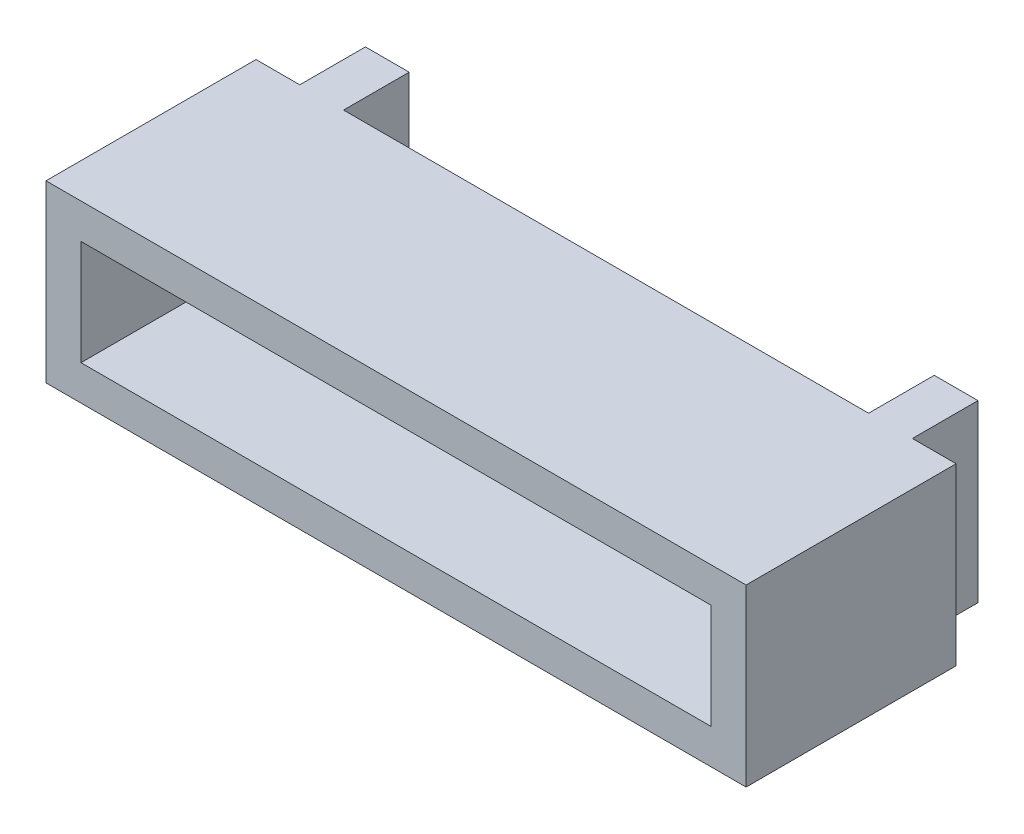
ISO-10303-21;
HEADER;
FILE_DESCRIPTION(('STEP AP214'),'2;1');
FILE_NAME('part.step','',(''),(''),'','','');
FILE_SCHEMA(('AUTOMOTIVE_DESIGN { 1 0 10303 214 1 1 1 1 }'));
ENDSEC;
DATA;
#1=APPLICATION_CONTEXT('core data for automotive mechanical design processes');
#2=APPLICATION_PROTOCOL_DEFINITION('international standard','automotive_design',2000,#1);
#3=PRODUCT_CONTEXT('',#1,'mechanical');
#4=PRODUCT('Part','Part','',(#3));
#5=PRODUCT_RELATED_PRODUCT_CATEGORY('part','',(#4));
#6=PRODUCT_DEFINITION_FORMATION('','',#4);
#7=PRODUCT_DEFINITION_CONTEXT('part definition',#1,'design');
#8=PRODUCT_DEFINITION('design','',#6,#7);
#9=PRODUCT_DEFINITION_SHAPE('','',#8);
#10=(LENGTH_UNIT() NAMED_UNIT(*) SI_UNIT(.MILLI.,.METRE.));
#11=(NAMED_UNIT(*) PLANE_ANGLE_UNIT() SI_UNIT($,.RADIAN.));
#12=(NAMED_UNIT(*) SI_UNIT($,.STERADIAN.) SOLID_ANGLE_UNIT());
#13=UNCERTAINTY_MEASURE_WITH_UNIT(LENGTH_MEASURE(1.E-05),#10,'distance_accuracy_value','');
#14=(GEOMETRIC_REPRESENTATION_CONTEXT(3) GLOBAL_UNCERTAINTY_ASSIGNED_CONTEXT((#13)) GLOBAL_UNIT_ASSIGNED_CONTEXT((#10,
#11,#12)) REPRESENTATION_CONTEXT('',''));
#15=CARTESIAN_POINT('',(0.,0.,0.));
#16=DIRECTION('',(0.,0.,1.));
#17=DIRECTION('',(1.,0.,0.));
#18=AXIS2_PLACEMENT_3D('',#15,#16,#17);
#19=CARTESIAN_POINT('',(-16.,8.,0.));
#20=DIRECTION('',(0.,0.,-1.));
#21=DIRECTION('',(-1.,0.,0.));
#22=AXIS2_PLACEMENT_3D('',#19,#20,#21);
#23=PLANE('',#22);
#24=DIRECTION('',(1.,0.,0.));
#25=VECTOR('',#24,1.);
#26=CARTESIAN_POINT('',(-16.,0.,0.));
#27=LINE('',#26,#25);
#28=CARTESIAN_POINT('',(-16.,0.,0.));
#29=VERTEX_POINT('',#28);
#30=CARTESIAN_POINT('',(16.,0.,0.));
#31=VERTEX_POINT('',#30);
#32=EDGE_CURVE('E192',#29,#31,#27,.T.);
#33=ORIENTED_EDGE('',*,*,#32,.T.);
#34=DIRECTION('',(0.,-1.,0.));
#35=VECTOR('',#34,1.);
#36=CARTESIAN_POINT('',(16.,8.,0.));
#37=LINE('',#36,#35);
#38=CARTESIAN_POINT('',(16.,8.,0.));
#39=VERTEX_POINT('',#38);
#40=EDGE_CURVE('E163',#39,#31,#37,.T.);
#41=ORIENTED_EDGE('',*,*,#40,.F.);
#42=DIRECTION('',(1.,0.,0.));
#43=VECTOR('',#42,1.);
#44=CARTESIAN_POINT('',(-16.,8.,0.));
#45=LINE('',#44,#43);
#46=CARTESIAN_POINT('',(-16.,8.,0.));
#47=VERTEX_POINT('',#46);
#48=EDGE_CURVE('E147',#47,#39,#45,.T.);
#49=ORIENTED_EDGE('',*,*,#48,.F.);
#50=DIRECTION('',(0.,-1.,0.));
#51=VECTOR('',#50,1.);
#52=CARTESIAN_POINT('',(-16.,8.,0.));
#53=LINE('',#52,#51);
#54=EDGE_CURVE('E156',#47,#29,#53,.T.);
#55=ORIENTED_EDGE('',*,*,#54,.T.);
#56=EDGE_LOOP('',(#33,#41,#49,#55));
#57=FACE_BOUND('',#56,.T.);
#58=DIRECTION('',(1.,0.,0.));
#59=VECTOR('',#58,1.);
#60=CARTESIAN_POINT('',(0.,1.6,0.));
#61=LINE('',#60,#59);
#62=CARTESIAN_POINT('',(-14.4,1.6,0.));
#63=VERTEX_POINT('',#62);
#64=CARTESIAN_POINT('',(14.4,1.6,0.));
#65=VERTEX_POINT('',#64);
#66=EDGE_CURVE('E285',#63,#65,#61,.T.);
#67=ORIENTED_EDGE('',*,*,#66,.F.);
#68=DIRECTION('',(0.,-1.,0.));
#69=VECTOR('',#68,1.);
#70=CARTESIAN_POINT('',(-14.4,8.,0.));
#71=LINE('',#70,#69);
#72=CARTESIAN_POINT('',(-14.4,6.4,0.));
#73=VERTEX_POINT('',#72);
#74=EDGE_CURVE('E283',#73,#63,#71,.T.);
#75=ORIENTED_EDGE('',*,*,#74,.F.);
#76=DIRECTION('',(1.,0.,0.));
#77=VECTOR('',#76,1.);
#78=CARTESIAN_POINT('',(0.,6.4,0.));
#79=LINE('',#78,#77);
#80=CARTESIAN_POINT('',(14.4,6.4,0.));
#81=VERTEX_POINT('',#80);
#82=EDGE_CURVE('E52',#73,#81,#79,.T.);
#83=ORIENTED_EDGE('',*,*,#82,.T.);
#84=DIRECTION('',(0.,-1.,0.));
#85=VECTOR('',#84,1.);
#86=CARTESIAN_POINT('',(14.4,8.,0.));
#87=LINE('',#86,#85);
#88=EDGE_CURVE('E280',#81,#65,#87,.T.);
#89=ORIENTED_EDGE('',*,*,#88,.T.);
#90=EDGE_LOOP('',(#67,#75,#83,#89));
#91=FACE_BOUND('',#90,.T.);
#92=ADVANCED_FACE('F37',(#57,#91),#23,.F.);
#93=CARTESIAN_POINT('',(14.,8.,-9.6));
#94=DIRECTION('',(0.,0.,1.));
#95=DIRECTION('',(1.,0.,0.));
#96=AXIS2_PLACEMENT_3D('',#93,#94,#95);
#97=PLANE('',#96);
#98=DIRECTION('',(-1.,0.,0.));
#99=VECTOR('',#98,1.);
#100=CARTESIAN_POINT('',(14.,0.,-9.6));
#101=LINE('',#100,#99);
#102=CARTESIAN_POINT('',(16.,0.,-9.6));
#103=VERTEX_POINT('',#102);
#104=CARTESIAN_POINT('',(14.,0.,-9.6));
#105=VERTEX_POINT('',#104);
#106=EDGE_CURVE('E171',#103,#105,#101,.T.);
#107=ORIENTED_EDGE('',*,*,#106,.T.);
#108=DIRECTION('',(0.,-1.,0.));
#109=VECTOR('',#108,1.);
#110=CARTESIAN_POINT('',(14.,8.,-9.6));
#111=LINE('',#110,#109);
#112=CARTESIAN_POINT('',(14.,8.,-9.6));
#113=VERTEX_POINT('',#112);
#114=EDGE_CURVE('E220',#113,#105,#111,.T.);
#115=ORIENTED_EDGE('',*,*,#114,.F.);
#116=DIRECTION('',(-1.,0.,0.));
#117=VECTOR('',#116,1.);
#118=CARTESIAN_POINT('',(14.,8.,-9.6));
#119=LINE('',#118,#117);
#120=CARTESIAN_POINT('',(16.,8.,-9.6));
#121=VERTEX_POINT('',#120);
#122=EDGE_CURVE('E195',#121,#113,#119,.T.);
#123=ORIENTED_EDGE('',*,*,#122,.F.);
#124=DIRECTION('',(0.,-1.,0.));
#125=VECTOR('',#124,1.);
#126=CARTESIAN_POINT('',(16.,8.,-9.6));
#127=LINE('',#126,#125);
#128=EDGE_CURVE('E167',#121,#103,#127,.T.);
#129=ORIENTED_EDGE('',*,*,#128,.T.);
#130=EDGE_LOOP('',(#107,#115,#123,#129));
#131=FACE_BOUND('',#130,.T.);
#132=ADVANCED_FACE('F39',(#131),#97,.F.);
#133=CARTESIAN_POINT('',(14.,8.,-12.6));
#134=DIRECTION('',(-1.,0.,0.));
#135=DIRECTION('',(0.,0.,1.));
#136=AXIS2_PLACEMENT_3D('',#133,#134,#135);
#137=PLANE('',#136);
#138=DIRECTION('',(0.,0.,-1.));
#139=VECTOR('',#138,1.);
#140=CARTESIAN_POINT('',(14.,0.,-12.6));
#141=LINE('',#140,#139);
#142=CARTESIAN_POINT('',(14.,0.,-12.6));
#143=VERTEX_POINT('',#142);
#144=EDGE_CURVE('E174',#105,#143,#141,.T.);
#145=ORIENTED_EDGE('',*,*,#144,.T.);
#146=DIRECTION('',(0.,-1.,0.));
#147=VECTOR('',#146,1.);
#148=CARTESIAN_POINT('',(14.,8.,-12.6));
#149=LINE('',#148,#147);
#150=CARTESIAN_POINT('',(14.,8.,-12.6));
#151=VERTEX_POINT('',#150);
#152=EDGE_CURVE('E217',#151,#143,#149,.T.);
#153=ORIENTED_EDGE('',*,*,#152,.F.);
#154=DIRECTION('',(0.,0.,-1.));
#155=VECTOR('',#154,1.);
#156=CARTESIAN_POINT('',(14.,8.,-12.6));
#157=LINE('',#156,#155);
#158=EDGE_CURVE('E115',#113,#151,#157,.T.);
#159=ORIENTED_EDGE('',*,*,#158,.F.);
#160=ORIENTED_EDGE('',*,*,#114,.T.);
#161=EDGE_LOOP('',(#145,#153,#159,#160));
#162=FACE_BOUND('',#161,.T.);
#163=ADVANCED_FACE('F354',(#162),#137,.F.);
#164=CARTESIAN_POINT('',(12.,8.,-12.6));
#165=DIRECTION('',(0.,0.,1.));
#166=DIRECTION('',(1.,0.,0.));
#167=AXIS2_PLACEMENT_3D('',#164,#165,#166);
#168=PLANE('',#167);
#169=DIRECTION('',(-1.,0.,0.));
#170=VECTOR('',#169,1.);
#171=CARTESIAN_POINT('',(12.,0.,-12.6));
#172=LINE('',#171,#170);
#173=CARTESIAN_POINT('',(12.,0.,-12.6));
#174=VERTEX_POINT('',#173);
#175=EDGE_CURVE('E177',#143,#174,#172,.T.);
#176=ORIENTED_EDGE('',*,*,#175,.T.);
#177=DIRECTION('',(0.,-1.,0.));
#178=VECTOR('',#177,1.);
#179=CARTESIAN_POINT('',(12.,8.,-12.6));
#180=LINE('',#179,#178);
#181=CARTESIAN_POINT('',(12.,8.,-12.6));
#182=VERTEX_POINT('',#181);
#183=EDGE_CURVE('E214',#182,#174,#180,.T.);
#184=ORIENTED_EDGE('',*,*,#183,.F.);
#185=DIRECTION('',(-1.,0.,0.));
#186=VECTOR('',#185,1.);
#187=CARTESIAN_POINT('',(12.,8.,-12.6));
#188=LINE('',#187,#186);
#189=EDGE_CURVE('E267',#151,#182,#188,.T.);
#190=ORIENTED_EDGE('',*,*,#189,.F.);
#191=ORIENTED_EDGE('',*,*,#152,.T.);
#192=EDGE_LOOP('',(#176,#184,#190,#191));
#193=FACE_BOUND('',#192,.T.);
#194=ADVANCED_FACE('F374',(#193),#168,.F.);
#195=CARTESIAN_POINT('',(12.,8.,-9.6));
#196=DIRECTION('',(1.,0.,0.));
#197=DIRECTION('',(0.,0.,-1.));
#198=AXIS2_PLACEMENT_3D('',#195,#196,#197);
#199=PLANE('',#198);
#200=DIRECTION('',(0.,0.,1.));
#201=VECTOR('',#200,1.);
#202=CARTESIAN_POINT('',(12.,0.,-9.6));
#203=LINE('',#202,#201);
#204=CARTESIAN_POINT('',(12.,0.,-9.6));
#205=VERTEX_POINT('',#204);
#206=EDGE_CURVE('E179',#174,#205,#203,.T.);
#207=ORIENTED_EDGE('',*,*,#206,.T.);
#208=DIRECTION('',(0.,-1.,0.));
#209=VECTOR('',#208,1.);
#210=CARTESIAN_POINT('',(12.,8.,-9.6));
#211=LINE('',#210,#209);
#212=CARTESIAN_POINT('',(12.,8.,-9.6));
#213=VERTEX_POINT('',#212);
#214=EDGE_CURVE('E211',#213,#205,#211,.T.);
#215=ORIENTED_EDGE('',*,*,#214,.F.);
#216=DIRECTION('',(0.,0.,1.));
#217=VECTOR('',#216,1.);
#218=CARTESIAN_POINT('',(12.,8.,-9.6));
#219=LINE('',#218,#217);
#220=EDGE_CURVE('E265',#182,#213,#219,.T.);
#221=ORIENTED_EDGE('',*,*,#220,.F.);
#222=ORIENTED_EDGE('',*,*,#183,.T.);
#223=EDGE_LOOP('',(#207,#215,#221,#222));
#224=FACE_BOUND('',#223,.T.);
#225=ADVANCED_FACE('F230',(#224),#199,.F.);
#226=CARTESIAN_POINT('',(-12.,8.,-9.6));
#227=DIRECTION('',(0.,0.,1.));
#228=DIRECTION('',(1.,0.,0.));
#229=AXIS2_PLACEMENT_3D('',#226,#227,#228);
#230=PLANE('',#229);
#231=CARTESIAN_POINT('',(4.,4.,-9.6));
#232=DIRECTION('',(0.,0.,1.));
#233=DIRECTION('',(1.,0.,0.));
#234=AXIS2_PLACEMENT_3D('',#231,#232,#233);
#235=CIRCLE('',#234,2.4);
#236=CARTESIAN_POINT('',(6.4,4.,-9.6));
#237=VERTEX_POINT('',#236);
#238=EDGE_CURVE('E11',#237,#237,#235,.F.);
#239=ORIENTED_EDGE('',*,*,#238,.F.);
#240=EDGE_LOOP('',(#239));
#241=FACE_BOUND('',#240,.T.);
#242=CARTESIAN_POINT('',(-4.,4.,-9.6));
#243=DIRECTION('',(0.,0.,1.));
#244=DIRECTION('',(1.,0.,0.));
#245=AXIS2_PLACEMENT_3D('',#242,#243,#244);
#246=CIRCLE('',#245,2.4);
#247=CARTESIAN_POINT('',(-1.6,4.,-9.6));
#248=VERTEX_POINT('',#247);
#249=EDGE_CURVE('E45',#248,#248,#246,.F.);
#250=ORIENTED_EDGE('',*,*,#249,.F.);
#251=EDGE_LOOP('',(#250));
#252=FACE_BOUND('',#251,.T.);
#253=DIRECTION('',(-1.,0.,0.));
#254=VECTOR('',#253,1.);
#255=CARTESIAN_POINT('',(-12.,0.,-9.6));
#256=LINE('',#255,#254);
#257=CARTESIAN_POINT('',(-12.,0.,-9.6));
#258=VERTEX_POINT('',#257);
#259=EDGE_CURVE('E181',#205,#258,#256,.T.);
#260=ORIENTED_EDGE('',*,*,#259,.T.);
#261=DIRECTION('',(0.,-1.,0.));
#262=VECTOR('',#261,1.);
#263=CARTESIAN_POINT('',(-12.,8.,-9.6));
#264=LINE('',#263,#262);
#265=CARTESIAN_POINT('',(-12.,8.,-9.6));
#266=VERTEX_POINT('',#265);
#267=EDGE_CURVE('E208',#266,#258,#264,.T.);
#268=ORIENTED_EDGE('',*,*,#267,.F.);
#269=DIRECTION('',(-1.,0.,0.));
#270=VECTOR('',#269,1.);
#271=CARTESIAN_POINT('',(-12.,8.,-9.6));
#272=LINE('',#271,#270);
#273=EDGE_CURVE('E263',#213,#266,#272,.T.);
#274=ORIENTED_EDGE('',*,*,#273,.F.);
#275=ORIENTED_EDGE('',*,*,#214,.T.);
#276=EDGE_LOOP('',(#260,#268,#274,#275));
#277=FACE_BOUND('',#276,.T.);
#278=ADVANCED_FACE('F226',(#241,#252,#277),#230,.F.);
#279=CARTESIAN_POINT('',(-12.,8.,-12.6));
#280=DIRECTION('',(-1.,0.,0.));
#281=DIRECTION('',(0.,0.,1.));
#282=AXIS2_PLACEMENT_3D('',#279,#280,#281);
#283=PLANE('',#282);
#284=DIRECTION('',(0.,0.,-1.));
#285=VECTOR('',#284,1.);
#286=CARTESIAN_POINT('',(-12.,0.,-12.6));
#287=LINE('',#286,#285);
#288=CARTESIAN_POINT('',(-12.,0.,-12.6));
#289=VERTEX_POINT('',#288);
#290=EDGE_CURVE('E183',#258,#289,#287,.T.);
#291=ORIENTED_EDGE('',*,*,#290,.T.);
#292=DIRECTION('',(0.,-1.,0.));
#293=VECTOR('',#292,1.);
#294=CARTESIAN_POINT('',(-12.,8.,-12.6));
#295=LINE('',#294,#293);
#296=CARTESIAN_POINT('',(-12.,8.,-12.6));
#297=VERTEX_POINT('',#296);
#298=EDGE_CURVE('E205',#297,#289,#295,.T.);
#299=ORIENTED_EDGE('',*,*,#298,.F.);
#300=DIRECTION('',(0.,0.,-1.));
#301=VECTOR('',#300,1.);
#302=CARTESIAN_POINT('',(-12.,8.,-12.6));
#303=LINE('',#302,#301);
#304=EDGE_CURVE('E243',#266,#297,#303,.T.);
#305=ORIENTED_EDGE('',*,*,#304,.F.);
#306=ORIENTED_EDGE('',*,*,#267,.T.);
#307=EDGE_LOOP('',(#291,#299,#305,#306));
#308=FACE_BOUND('',#307,.T.);
#309=ADVANCED_FACE('F229',(#308),#283,.F.);
#310=CARTESIAN_POINT('',(-14.,8.,-12.6));
#311=DIRECTION('',(0.,0.,1.));
#312=DIRECTION('',(1.,0.,0.));
#313=AXIS2_PLACEMENT_3D('',#310,#311,#312);
#314=PLANE('',#313);
#315=DIRECTION('',(-1.,0.,0.));
#316=VECTOR('',#315,1.);
#317=CARTESIAN_POINT('',(-14.,0.,-12.6));
#318=LINE('',#317,#316);
#319=CARTESIAN_POINT('',(-14.,0.,-12.6));
#320=VERTEX_POINT('',#319);
#321=EDGE_CURVE('E185',#289,#320,#318,.T.);
#322=ORIENTED_EDGE('',*,*,#321,.T.);
#323=DIRECTION('',(0.,-1.,0.));
#324=VECTOR('',#323,1.);
#325=CARTESIAN_POINT('',(-14.,8.,-12.6));
#326=LINE('',#325,#324);
#327=CARTESIAN_POINT('',(-14.,8.,-12.6));
#328=VERTEX_POINT('',#327);
#329=EDGE_CURVE('E202',#328,#320,#326,.T.);
#330=ORIENTED_EDGE('',*,*,#329,.F.);
#331=DIRECTION('',(-1.,0.,0.));
#332=VECTOR('',#331,1.);
#333=CARTESIAN_POINT('',(-14.,8.,-12.6));
#334=LINE('',#333,#332);
#335=EDGE_CURVE('E258',#297,#328,#334,.T.);
#336=ORIENTED_EDGE('',*,*,#335,.F.);
#337=ORIENTED_EDGE('',*,*,#298,.T.);
#338=EDGE_LOOP('',(#322,#330,#336,#337));
#339=FACE_BOUND('',#338,.T.);
#340=ADVANCED_FACE('F251',(#339),#314,.F.);
#341=CARTESIAN_POINT('',(-14.,8.,-9.6));
#342=DIRECTION('',(1.,0.,0.));
#343=DIRECTION('',(0.,0.,-1.));
#344=AXIS2_PLACEMENT_3D('',#341,#342,#343);
#345=PLANE('',#344);
#346=DIRECTION('',(0.,0.,1.));
#347=VECTOR('',#346,1.);
#348=CARTESIAN_POINT('',(-14.,0.,-9.6));
#349=LINE('',#348,#347);
#350=CARTESIAN_POINT('',(-14.,0.,-9.6));
#351=VERTEX_POINT('',#350);
#352=EDGE_CURVE('E187',#320,#351,#349,.T.);
#353=ORIENTED_EDGE('',*,*,#352,.T.);
#354=DIRECTION('',(0.,-1.,0.));
#355=VECTOR('',#354,1.);
#356=CARTESIAN_POINT('',(-14.,8.,-9.6));
#357=LINE('',#356,#355);
#358=CARTESIAN_POINT('',(-14.,8.,-9.6));
#359=VERTEX_POINT('',#358);
#360=EDGE_CURVE('E199',#359,#351,#357,.T.);
#361=ORIENTED_EDGE('',*,*,#360,.F.);
#362=DIRECTION('',(0.,0.,1.));
#363=VECTOR('',#362,1.);
#364=CARTESIAN_POINT('',(-14.,8.,-9.6));
#365=LINE('',#364,#363);
#366=EDGE_CURVE('E257',#328,#359,#365,.T.);
#367=ORIENTED_EDGE('',*,*,#366,.F.);
#368=ORIENTED_EDGE('',*,*,#329,.T.);
#369=EDGE_LOOP('',(#353,#361,#367,#368));
#370=FACE_BOUND('',#369,.T.);
#371=ADVANCED_FACE('F255',(#370),#345,.F.);
#372=CARTESIAN_POINT('',(-16.,8.,-9.6));
#373=DIRECTION('',(0.,0.,1.));
#374=DIRECTION('',(1.,0.,0.));
#375=AXIS2_PLACEMENT_3D('',#372,#373,#374);
#376=PLANE('',#375);
#377=DIRECTION('',(-1.,0.,0.));
#378=VECTOR('',#377,1.);
#379=CARTESIAN_POINT('',(-16.,0.,-9.6));
#380=LINE('',#379,#378);
#381=CARTESIAN_POINT('',(-16.,0.,-9.6));
#382=VERTEX_POINT('',#381);
#383=EDGE_CURVE('E189',#351,#382,#380,.T.);
#384=ORIENTED_EDGE('',*,*,#383,.T.);
#385=DIRECTION('',(0.,-1.,0.));
#386=VECTOR('',#385,1.);
#387=CARTESIAN_POINT('',(-16.,8.,-9.6));
#388=LINE('',#387,#386);
#389=CARTESIAN_POINT('',(-16.,8.,-9.6));
#390=VERTEX_POINT('',#389);
#391=EDGE_CURVE('E162',#390,#382,#388,.T.);
#392=ORIENTED_EDGE('',*,*,#391,.F.);
#393=DIRECTION('',(-1.,0.,0.));
#394=VECTOR('',#393,1.);
#395=CARTESIAN_POINT('',(-16.,8.,-9.6));
#396=LINE('',#395,#394);
#397=EDGE_CURVE('E150',#359,#390,#396,.T.);
#398=ORIENTED_EDGE('',*,*,#397,.F.);
#399=ORIENTED_EDGE('',*,*,#360,.T.);
#400=EDGE_LOOP('',(#384,#392,#398,#399));
#401=FACE_BOUND('',#400,.T.);
#402=ADVANCED_FACE('F362',(#401),#376,.F.);
#403=CARTESIAN_POINT('',(-16.,8.,0.));
#404=DIRECTION('',(1.,0.,0.));
#405=DIRECTION('',(0.,0.,-1.));
#406=AXIS2_PLACEMENT_3D('',#403,#404,#405);
#407=PLANE('',#406);
#408=DIRECTION('',(0.,0.,1.));
#409=VECTOR('',#408,1.);
#410=CARTESIAN_POINT('',(-16.,0.,0.));
#411=LINE('',#410,#409);
#412=EDGE_CURVE('E159',#382,#29,#411,.T.);
#413=ORIENTED_EDGE('',*,*,#412,.T.);
#414=ORIENTED_EDGE('',*,*,#54,.F.);
#415=DIRECTION('',(0.,0.,1.));
#416=VECTOR('',#415,1.);
#417=CARTESIAN_POINT('',(-16.,8.,0.));
#418=LINE('',#417,#416);
#419=EDGE_CURVE('E143',#390,#47,#418,.T.);
#420=ORIENTED_EDGE('',*,*,#419,.F.);
#421=ORIENTED_EDGE('',*,*,#391,.T.);
#422=EDGE_LOOP('',(#413,#414,#420,#421));
#423=FACE_BOUND('',#422,.T.);
#424=ADVANCED_FACE('F157',(#423),#407,.F.);
#425=CARTESIAN_POINT('',(16.,8.,-9.6));
#426=DIRECTION('',(-1.,0.,0.));
#427=DIRECTION('',(0.,0.,1.));
#428=AXIS2_PLACEMENT_3D('',#425,#426,#427);
#429=PLANE('',#428);
#430=DIRECTION('',(0.,0.,-1.));
#431=VECTOR('',#430,1.);
#432=CARTESIAN_POINT('',(16.,0.,-9.6));
#433=LINE('',#432,#431);
#434=EDGE_CURVE('E106',#31,#103,#433,.T.);
#435=ORIENTED_EDGE('',*,*,#434,.T.);
#436=ORIENTED_EDGE('',*,*,#128,.F.);
#437=DIRECTION('',(0.,0.,-1.));
#438=VECTOR('',#437,1.);
#439=CARTESIAN_POINT('',(16.,8.,-9.6));
#440=LINE('',#439,#438);
#441=EDGE_CURVE('E61',#39,#121,#440,.T.);
#442=ORIENTED_EDGE('',*,*,#441,.F.);
#443=ORIENTED_EDGE('',*,*,#40,.T.);
#444=EDGE_LOOP('',(#435,#436,#442,#443));
#445=FACE_BOUND('',#444,.T.);
#446=ADVANCED_FACE('F358',(#445),#429,.F.);
#447=CARTESIAN_POINT('',(0.,8.,0.));
#448=DIRECTION('',(0.,-1.,0.));
#449=DIRECTION('',(0.,0.,-1.));
#450=AXIS2_PLACEMENT_3D('',#447,#448,#449);
#451=PLANE('',#450);
#452=ORIENTED_EDGE('',*,*,#122,.T.);
#453=ORIENTED_EDGE('',*,*,#158,.T.);
#454=ORIENTED_EDGE('',*,*,#189,.T.);
#455=ORIENTED_EDGE('',*,*,#220,.T.);
#456=ORIENTED_EDGE('',*,*,#273,.T.);
#457=ORIENTED_EDGE('',*,*,#304,.T.);
#458=ORIENTED_EDGE('',*,*,#335,.T.);
#459=ORIENTED_EDGE('',*,*,#366,.T.);
#460=ORIENTED_EDGE('',*,*,#397,.T.);
#461=ORIENTED_EDGE('',*,*,#419,.T.);
#462=ORIENTED_EDGE('',*,*,#48,.T.);
#463=ORIENTED_EDGE('',*,*,#441,.T.);
#464=EDGE_LOOP('',(#452,#453,#454,#455,#456,#457,#458,#459,#460,#461,#462,#463));
#465=FACE_BOUND('',#464,.T.);
#466=ADVANCED_FACE('F145',(#465),#451,.F.);
#467=CARTESIAN_POINT('',(0.,0.,0.));
#468=DIRECTION('',(0.,-1.,0.));
#469=DIRECTION('',(0.,0.,-1.));
#470=AXIS2_PLACEMENT_3D('',#467,#468,#469);
#471=PLANE('',#470);
#472=ORIENTED_EDGE('',*,*,#106,.F.);
#473=ORIENTED_EDGE('',*,*,#434,.F.);
#474=ORIENTED_EDGE('',*,*,#32,.F.);
#475=ORIENTED_EDGE('',*,*,#412,.F.);
#476=ORIENTED_EDGE('',*,*,#383,.F.);
#477=ORIENTED_EDGE('',*,*,#352,.F.);
#478=ORIENTED_EDGE('',*,*,#321,.F.);
#479=ORIENTED_EDGE('',*,*,#290,.F.);
#480=ORIENTED_EDGE('',*,*,#259,.F.);
#481=ORIENTED_EDGE('',*,*,#206,.F.);
#482=ORIENTED_EDGE('',*,*,#175,.F.);
#483=ORIENTED_EDGE('',*,*,#144,.F.);
#484=EDGE_LOOP('',(#472,#473,#474,#475,#476,#477,#478,#479,#480,#481,#482,#483));
#485=FACE_BOUND('',#484,.T.);
#486=ADVANCED_FACE('F246',(#485),#471,.T.);
#487=CARTESIAN_POINT('',(-4.,4.,-11.2));
#488=DIRECTION('',(0.,0.,1.));
#489=DIRECTION('',(1.,0.,0.));
#490=AXIS2_PLACEMENT_3D('',#487,#488,#489);
#491=CYLINDRICAL_SURFACE('',#490,2.4);
#492=CARTESIAN_POINT('',(-4.,4.,-11.2));
#493=DIRECTION('',(0.,0.,-1.));
#494=DIRECTION('',(-1.,0.,0.));
#495=AXIS2_PLACEMENT_3D('',#492,#493,#494);
#496=CIRCLE('',#495,2.4);
#497=CARTESIAN_POINT('',(-6.4,4.,-11.2));
#498=VERTEX_POINT('',#497);
#499=EDGE_CURVE('E175',#498,#498,#496,.T.);
#500=ORIENTED_EDGE('',*,*,#499,.F.);
#501=EDGE_LOOP('',(#500));
#502=FACE_BOUND('',#501,.T.);
#503=ORIENTED_EDGE('',*,*,#249,.T.);
#504=EDGE_LOOP('',(#503));
#505=FACE_BOUND('',#504,.T.);
#506=ADVANCED_FACE('F224',(#502,#505),#491,.T.);
#507=CARTESIAN_POINT('',(-4.,4.,-11.2));
#508=DIRECTION('',(0.,0.,-1.));
#509=DIRECTION('',(-1.,0.,0.));
#510=AXIS2_PLACEMENT_3D('',#507,#508,#509);
#511=PLANE('',#510);
#512=ORIENTED_EDGE('',*,*,#499,.T.);
#513=EDGE_LOOP('',(#512));
#514=FACE_BOUND('',#513,.T.);
#515=ADVANCED_FACE('F398',(#514),#511,.T.);
#516=CARTESIAN_POINT('',(4.,4.,-11.2));
#517=DIRECTION('',(0.,0.,1.));
#518=DIRECTION('',(1.,0.,0.));
#519=AXIS2_PLACEMENT_3D('',#516,#517,#518);
#520=CYLINDRICAL_SURFACE('',#519,2.4);
#521=CARTESIAN_POINT('',(4.,4.,-11.2));
#522=DIRECTION('',(0.,0.,-1.));
#523=DIRECTION('',(-1.,0.,0.));
#524=AXIS2_PLACEMENT_3D('',#521,#522,#523);
#525=CIRCLE('',#524,2.4);
#526=CARTESIAN_POINT('',(1.6,4.,-11.2));
#527=VERTEX_POINT('',#526);
#528=EDGE_CURVE('E273',#527,#527,#525,.T.);
#529=ORIENTED_EDGE('',*,*,#528,.F.);
#530=EDGE_LOOP('',(#529));
#531=FACE_BOUND('',#530,.T.);
#532=ORIENTED_EDGE('',*,*,#238,.T.);
#533=EDGE_LOOP('',(#532));
#534=FACE_BOUND('',#533,.T.);
#535=ADVANCED_FACE('F402',(#531,#534),#520,.T.);
#536=CARTESIAN_POINT('',(4.,4.,-11.2));
#537=DIRECTION('',(0.,0.,-1.));
#538=DIRECTION('',(-1.,0.,0.));
#539=AXIS2_PLACEMENT_3D('',#536,#537,#538);
#540=PLANE('',#539);
#541=ORIENTED_EDGE('',*,*,#528,.T.);
#542=EDGE_LOOP('',(#541));
#543=FACE_BOUND('',#542,.T.);
#544=ADVANCED_FACE('F406',(#543),#540,.T.);
#545=CARTESIAN_POINT('',(-16.,8.,-8.));
#546=DIRECTION('',(0.,0.,1.));
#547=DIRECTION('',(1.,0.,0.));
#548=AXIS2_PLACEMENT_3D('',#545,#546,#547);
#549=PLANE('',#548);
#550=DIRECTION('',(0.,-1.,0.));
#551=VECTOR('',#550,1.);
#552=CARTESIAN_POINT('',(-14.4,8.,-8.));
#553=LINE('',#552,#551);
#554=CARTESIAN_POINT('',(-14.4,6.4,-8.));
#555=VERTEX_POINT('',#554);
#556=CARTESIAN_POINT('',(-14.4,1.6,-8.));
#557=VERTEX_POINT('',#556);
#558=EDGE_CURVE('E292',#555,#557,#553,.T.);
#559=ORIENTED_EDGE('',*,*,#558,.T.);
#560=DIRECTION('',(-1.,0.,0.));
#561=VECTOR('',#560,1.);
#562=CARTESIAN_POINT('',(0.,1.6,-8.));
#563=LINE('',#562,#561);
#564=CARTESIAN_POINT('',(14.4,1.6,-8.));
#565=VERTEX_POINT('',#564);
#566=EDGE_CURVE('E299',#565,#557,#563,.T.);
#567=ORIENTED_EDGE('',*,*,#566,.F.);
#568=DIRECTION('',(0.,-1.,0.));
#569=VECTOR('',#568,1.);
#570=CARTESIAN_POINT('',(14.4,8.,-8.));
#571=LINE('',#570,#569);
#572=CARTESIAN_POINT('',(14.4,6.4,-8.));
#573=VERTEX_POINT('',#572);
#574=EDGE_CURVE('E284',#573,#565,#571,.T.);
#575=ORIENTED_EDGE('',*,*,#574,.F.);
#576=DIRECTION('',(-1.,0.,0.));
#577=VECTOR('',#576,1.);
#578=CARTESIAN_POINT('',(0.,6.4,-8.));
#579=LINE('',#578,#577);
#580=EDGE_CURVE('E302',#573,#555,#579,.T.);
#581=ORIENTED_EDGE('',*,*,#580,.T.);
#582=EDGE_LOOP('',(#559,#567,#575,#581));
#583=FACE_BOUND('',#582,.T.);
#584=CARTESIAN_POINT('',(-4.,4.,-8.));
#585=DIRECTION('',(0.,0.,1.));
#586=DIRECTION('',(1.,0.,0.));
#587=AXIS2_PLACEMENT_3D('',#584,#585,#586);
#588=CIRCLE('',#587,0.799999999999999);
#589=CARTESIAN_POINT('',(-3.2,4.,-8.));
#590=VERTEX_POINT('',#589);
#591=EDGE_CURVE('E310',#590,#590,#588,.F.);
#592=ORIENTED_EDGE('',*,*,#591,.T.);
#593=EDGE_LOOP('',(#592));
#594=FACE_BOUND('',#593,.T.);
#595=CARTESIAN_POINT('',(4.,4.,-8.));
#596=DIRECTION('',(0.,0.,1.));
#597=DIRECTION('',(1.,0.,0.));
#598=AXIS2_PLACEMENT_3D('',#595,#596,#597);
#599=CIRCLE('',#598,0.8);
#600=CARTESIAN_POINT('',(4.8,4.,-8.));
#601=VERTEX_POINT('',#600);
#602=EDGE_CURVE('E276',#601,#601,#599,.F.);
#603=ORIENTED_EDGE('',*,*,#602,.T.);
#604=EDGE_LOOP('',(#603));
#605=FACE_BOUND('',#604,.T.);
#606=ADVANCED_FACE('F325',(#583,#594,#605),#549,.T.);
#607=CARTESIAN_POINT('',(-14.4,8.,0.));
#608=DIRECTION('',(1.,0.,0.));
#609=DIRECTION('',(0.,0.,-1.));
#610=AXIS2_PLACEMENT_3D('',#607,#608,#609);
#611=PLANE('',#610);
#612=DIRECTION('',(0.,0.,1.));
#613=VECTOR('',#612,1.);
#614=CARTESIAN_POINT('',(-14.4,1.6,0.));
#615=LINE('',#614,#613);
#616=EDGE_CURVE('E289',#557,#63,#615,.T.);
#617=ORIENTED_EDGE('',*,*,#616,.F.);
#618=ORIENTED_EDGE('',*,*,#558,.F.);
#619=DIRECTION('',(0.,0.,1.));
#620=VECTOR('',#619,1.);
#621=CARTESIAN_POINT('',(-14.4,6.4,0.));
#622=LINE('',#621,#620);
#623=EDGE_CURVE('E279',#555,#73,#622,.T.);
#624=ORIENTED_EDGE('',*,*,#623,.T.);
#625=ORIENTED_EDGE('',*,*,#74,.T.);
#626=EDGE_LOOP('',(#617,#618,#624,#625));
#627=FACE_BOUND('',#626,.T.);
#628=ADVANCED_FACE('F333',(#627),#611,.T.);
#629=CARTESIAN_POINT('',(14.4,8.,-9.6));
#630=DIRECTION('',(-1.,0.,0.));
#631=DIRECTION('',(0.,0.,1.));
#632=AXIS2_PLACEMENT_3D('',#629,#630,#631);
#633=PLANE('',#632);
#634=DIRECTION('',(0.,0.,-1.));
#635=VECTOR('',#634,1.);
#636=CARTESIAN_POINT('',(14.4,1.6,0.));
#637=LINE('',#636,#635);
#638=EDGE_CURVE('E288',#65,#565,#637,.T.);
#639=ORIENTED_EDGE('',*,*,#638,.F.);
#640=ORIENTED_EDGE('',*,*,#88,.F.);
#641=DIRECTION('',(0.,0.,-1.));
#642=VECTOR('',#641,1.);
#643=CARTESIAN_POINT('',(14.4,6.4,0.));
#644=LINE('',#643,#642);
#645=EDGE_CURVE('E278',#81,#573,#644,.T.);
#646=ORIENTED_EDGE('',*,*,#645,.T.);
#647=ORIENTED_EDGE('',*,*,#574,.T.);
#648=EDGE_LOOP('',(#639,#640,#646,#647));
#649=FACE_BOUND('',#648,.T.);
#650=ADVANCED_FACE('F338',(#649),#633,.T.);
#651=CARTESIAN_POINT('',(0.,6.4,0.));
#652=DIRECTION('',(0.,-1.,0.));
#653=DIRECTION('',(0.,0.,-1.));
#654=AXIS2_PLACEMENT_3D('',#651,#652,#653);
#655=PLANE('',#654);
#656=ORIENTED_EDGE('',*,*,#580,.F.);
#657=ORIENTED_EDGE('',*,*,#645,.F.);
#658=ORIENTED_EDGE('',*,*,#82,.F.);
#659=ORIENTED_EDGE('',*,*,#623,.F.);
#660=EDGE_LOOP('',(#656,#657,#658,#659));
#661=FACE_BOUND('',#660,.T.);
#662=ADVANCED_FACE('F335',(#661),#655,.T.);
#663=CARTESIAN_POINT('',(0.,1.6,0.));
#664=DIRECTION('',(0.,-1.,0.));
#665=DIRECTION('',(0.,0.,-1.));
#666=AXIS2_PLACEMENT_3D('',#663,#664,#665);
#667=PLANE('',#666);
#668=ORIENTED_EDGE('',*,*,#566,.T.);
#669=ORIENTED_EDGE('',*,*,#616,.T.);
#670=ORIENTED_EDGE('',*,*,#66,.T.);
#671=ORIENTED_EDGE('',*,*,#638,.T.);
#672=EDGE_LOOP('',(#668,#669,#670,#671));
#673=FACE_BOUND('',#672,.T.);
#674=ADVANCED_FACE('F337',(#673),#667,.F.);
#675=CARTESIAN_POINT('',(-4.,4.,-11.2));
#676=DIRECTION('',(0.,0.,1.));
#677=DIRECTION('',(1.,0.,0.));
#678=AXIS2_PLACEMENT_3D('',#675,#676,#677);
#679=CYLINDRICAL_SURFACE('',#678,0.799999999999999);
#680=CARTESIAN_POINT('',(-4.,4.,-9.6));
#681=DIRECTION('',(0.,0.,-1.));
#682=DIRECTION('',(-1.,0.,0.));
#683=AXIS2_PLACEMENT_3D('',#680,#681,#682);
#684=CIRCLE('',#683,0.799999999999999);
#685=CARTESIAN_POINT('',(-4.8,4.,-9.6));
#686=VERTEX_POINT('',#685);
#687=EDGE_CURVE('E296',#686,#686,#684,.T.);
#688=ORIENTED_EDGE('',*,*,#687,.T.);
#689=EDGE_LOOP('',(#688));
#690=FACE_BOUND('',#689,.T.);
#691=ORIENTED_EDGE('',*,*,#591,.F.);
#692=EDGE_LOOP('',(#691));
#693=FACE_BOUND('',#692,.T.);
#694=ADVANCED_FACE('F344',(#690,#693),#679,.F.);
#695=CARTESIAN_POINT('',(-4.,4.,-9.6));
#696=DIRECTION('',(0.,0.,-1.));
#697=DIRECTION('',(-1.,0.,0.));
#698=AXIS2_PLACEMENT_3D('',#695,#696,#697);
#699=PLANE('',#698);
#700=ORIENTED_EDGE('',*,*,#687,.F.);
#701=EDGE_LOOP('',(#700));
#702=FACE_BOUND('',#701,.T.);
#703=ADVANCED_FACE('F418',(#702),#699,.F.);
#704=CARTESIAN_POINT('',(4.,4.,-11.2));
#705=DIRECTION('',(0.,0.,1.));
#706=DIRECTION('',(1.,0.,0.));
#707=AXIS2_PLACEMENT_3D('',#704,#705,#706);
#708=CYLINDRICAL_SURFACE('',#707,0.8);
#709=CARTESIAN_POINT('',(4.,4.,-9.6));
#710=DIRECTION('',(0.,0.,-1.));
#711=DIRECTION('',(-1.,0.,0.));
#712=AXIS2_PLACEMENT_3D('',#709,#710,#711);
#713=CIRCLE('',#712,0.8);
#714=CARTESIAN_POINT('',(3.2,4.,-9.6));
#715=VERTEX_POINT('',#714);
#716=EDGE_CURVE('E293',#715,#715,#713,.T.);
#717=ORIENTED_EDGE('',*,*,#716,.T.);
#718=EDGE_LOOP('',(#717));
#719=FACE_BOUND('',#718,.T.);
#720=ORIENTED_EDGE('',*,*,#602,.F.);
#721=EDGE_LOOP('',(#720));
#722=FACE_BOUND('',#721,.T.);
#723=ADVANCED_FACE('F414',(#719,#722),#708,.F.);
#724=CARTESIAN_POINT('',(4.,4.,-9.6));
#725=DIRECTION('',(0.,0.,-1.));
#726=DIRECTION('',(-1.,0.,0.));
#727=AXIS2_PLACEMENT_3D('',#724,#725,#726);
#728=PLANE('',#727);
#729=ORIENTED_EDGE('',*,*,#716,.F.);
#730=EDGE_LOOP('',(#729));
#731=FACE_BOUND('',#730,.T.);
#732=ADVANCED_FACE('F411',(#731),#728,.F.);
#733=CLOSED_SHELL('',(#92,#132,#163,#194,#225,#278,#309,#340,#371,#402,#424,#446,#466,#486,#506,
#515,#535,#544,#606,#628,#650,#662,#674,#694,#703,#723,#732));
#734=MANIFOLD_SOLID_BREP('B2',#733);
#735=ADVANCED_BREP_SHAPE_REPRESENTATION('',(#18,#734),#14);
#736=SHAPE_DEFINITION_REPRESENTATION(#9,#735);
ENDSEC;
END-ISO-10303-21;
